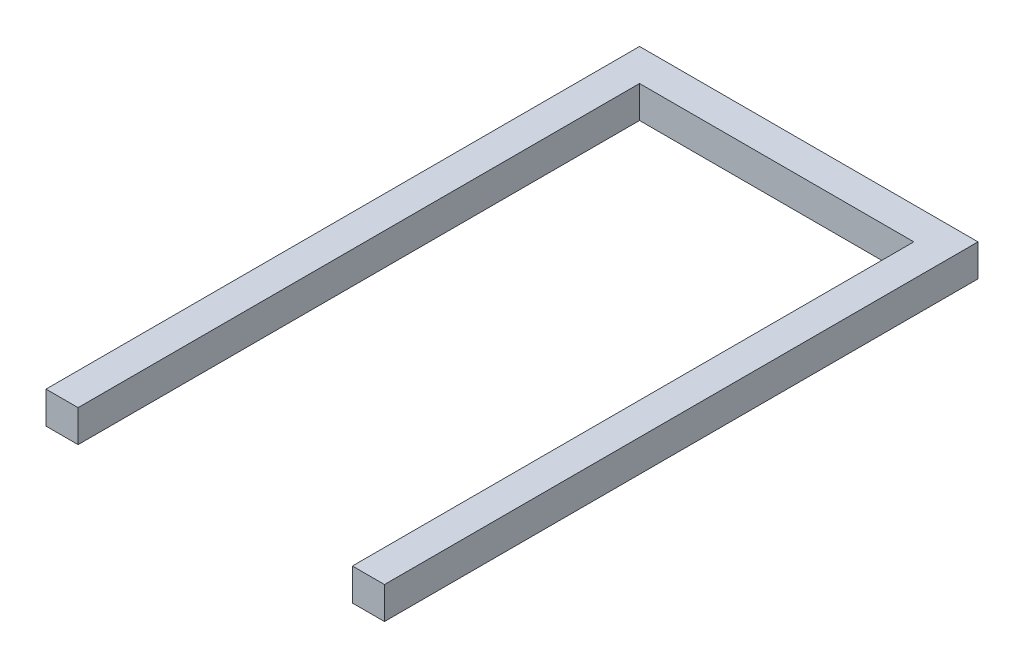
ISO-10303-21;
HEADER;
FILE_DESCRIPTION(('STEP AP214'),'2;1');
FILE_NAME('part.step','',(''),(''),'','','');
FILE_SCHEMA(('AUTOMOTIVE_DESIGN { 1 0 10303 214 1 1 1 1 }'));
ENDSEC;
DATA;
#1=APPLICATION_CONTEXT('core data for automotive mechanical design processes');
#2=APPLICATION_PROTOCOL_DEFINITION('international standard','automotive_design',2000,#1);
#3=PRODUCT_CONTEXT('',#1,'mechanical');
#4=PRODUCT('Part','Part','',(#3));
#5=PRODUCT_RELATED_PRODUCT_CATEGORY('part','',(#4));
#6=PRODUCT_DEFINITION_FORMATION('','',#4);
#7=PRODUCT_DEFINITION_CONTEXT('part definition',#1,'design');
#8=PRODUCT_DEFINITION('design','',#6,#7);
#9=PRODUCT_DEFINITION_SHAPE('','',#8);
#10=(LENGTH_UNIT() NAMED_UNIT(*) SI_UNIT(.MILLI.,.METRE.));
#11=(NAMED_UNIT(*) PLANE_ANGLE_UNIT() SI_UNIT($,.RADIAN.));
#12=(NAMED_UNIT(*) SI_UNIT($,.STERADIAN.) SOLID_ANGLE_UNIT());
#13=UNCERTAINTY_MEASURE_WITH_UNIT(LENGTH_MEASURE(1.E-05),#10,'distance_accuracy_value','');
#14=(GEOMETRIC_REPRESENTATION_CONTEXT(3) GLOBAL_UNCERTAINTY_ASSIGNED_CONTEXT((#13)) GLOBAL_UNIT_ASSIGNED_CONTEXT((#10,
#11,#12)) REPRESENTATION_CONTEXT('',''));
#15=CARTESIAN_POINT('',(0.,0.,0.));
#16=DIRECTION('',(0.,0.,1.));
#17=DIRECTION('',(1.,0.,0.));
#18=AXIS2_PLACEMENT_3D('',#15,#16,#17);
#19=CARTESIAN_POINT('',(-47.1813816435666,4.,26.7689393939394));
#20=DIRECTION('',(0.,0.,-1.));
#21=DIRECTION('',(-1.,0.,0.));
#22=AXIS2_PLACEMENT_3D('',#19,#20,#21);
#23=PLANE('',#22);
#24=DIRECTION('',(1.,0.,0.));
#25=VECTOR('',#24,1.);
#26=CARTESIAN_POINT('',(-47.1813816435666,0.,26.7689393939394));
#27=LINE('',#26,#25);
#28=CARTESIAN_POINT('',(-51.1813816435666,0.,26.7689393939394));
#29=VERTEX_POINT('',#28);
#30=CARTESIAN_POINT('',(-47.1813816435666,0.,26.7689393939394));
#31=VERTEX_POINT('',#30);
#32=EDGE_CURVE('E134',#29,#31,#27,.T.);
#33=ORIENTED_EDGE('',*,*,#32,.T.);
#34=DIRECTION('',(0.,-1.,0.));
#35=VECTOR('',#34,1.);
#36=CARTESIAN_POINT('',(-47.1813816435666,4.,26.7689393939394));
#37=LINE('',#36,#35);
#38=CARTESIAN_POINT('',(-47.1813816435666,4.,26.7689393939394));
#39=VERTEX_POINT('',#38);
#40=EDGE_CURVE('E11',#39,#31,#37,.T.);
#41=ORIENTED_EDGE('',*,*,#40,.F.);
#42=DIRECTION('',(1.,0.,0.));
#43=VECTOR('',#42,1.);
#44=CARTESIAN_POINT('',(-47.1813816435666,4.,26.7689393939394));
#45=LINE('',#44,#43);
#46=CARTESIAN_POINT('',(-51.1813816435666,4.,26.7689393939394));
#47=VERTEX_POINT('',#46);
#48=EDGE_CURVE('E146',#47,#39,#45,.T.);
#49=ORIENTED_EDGE('',*,*,#48,.F.);
#50=DIRECTION('',(0.,-1.,0.));
#51=VECTOR('',#50,1.);
#52=CARTESIAN_POINT('',(-51.1813816435666,4.,26.7689393939394));
#53=LINE('',#52,#51);
#54=EDGE_CURVE('E131',#47,#29,#53,.T.);
#55=ORIENTED_EDGE('',*,*,#54,.T.);
#56=EDGE_LOOP('',(#33,#41,#49,#55));
#57=FACE_BOUND('',#56,.T.);
#58=ADVANCED_FACE('F39',(#57),#23,.F.);
#59=CARTESIAN_POINT('',(-47.1813816435666,4.,-43.2310606060606));
#60=DIRECTION('',(-1.,0.,0.));
#61=DIRECTION('',(0.,0.,1.));
#62=AXIS2_PLACEMENT_3D('',#59,#60,#61);
#63=PLANE('',#62);
#64=DIRECTION('',(0.,0.,-1.));
#65=VECTOR('',#64,1.);
#66=CARTESIAN_POINT('',(-47.1813816435666,0.,-43.2310606060606));
#67=LINE('',#66,#65);
#68=CARTESIAN_POINT('',(-47.1813816435666,0.,-43.2310606060606));
#69=VERTEX_POINT('',#68);
#70=EDGE_CURVE('E138',#31,#69,#67,.T.);
#71=ORIENTED_EDGE('',*,*,#70,.T.);
#72=DIRECTION('',(0.,-1.,0.));
#73=VECTOR('',#72,1.);
#74=CARTESIAN_POINT('',(-47.1813816435666,4.,-43.2310606060606));
#75=LINE('',#74,#73);
#76=CARTESIAN_POINT('',(-47.1813816435666,4.,-43.2310606060606));
#77=VERTEX_POINT('',#76);
#78=EDGE_CURVE('E50',#77,#69,#75,.T.);
#79=ORIENTED_EDGE('',*,*,#78,.F.);
#80=DIRECTION('',(0.,0.,-1.));
#81=VECTOR('',#80,1.);
#82=CARTESIAN_POINT('',(-47.1813816435666,4.,-43.2310606060606));
#83=LINE('',#82,#81);
#84=EDGE_CURVE('E97',#39,#77,#83,.T.);
#85=ORIENTED_EDGE('',*,*,#84,.F.);
#86=ORIENTED_EDGE('',*,*,#40,.T.);
#87=EDGE_LOOP('',(#71,#79,#85,#86));
#88=FACE_BOUND('',#87,.T.);
#89=ADVANCED_FACE('F182',(#88),#63,.F.);
#90=CARTESIAN_POINT('',(-12.9813816435666,4.,-43.2310606060606));
#91=DIRECTION('',(0.,0.,-1.));
#92=DIRECTION('',(-1.,0.,0.));
#93=AXIS2_PLACEMENT_3D('',#90,#91,#92);
#94=PLANE('',#93);
#95=DIRECTION('',(1.,0.,0.));
#96=VECTOR('',#95,1.);
#97=CARTESIAN_POINT('',(-12.9813816435666,0.,-43.2310606060606));
#98=LINE('',#97,#96);
#99=CARTESIAN_POINT('',(-12.9813816435666,0.,-43.2310606060606));
#100=VERTEX_POINT('',#99);
#101=EDGE_CURVE('E139',#69,#100,#98,.T.);
#102=ORIENTED_EDGE('',*,*,#101,.T.);
#103=DIRECTION('',(0.,-1.,0.));
#104=VECTOR('',#103,1.);
#105=CARTESIAN_POINT('',(-12.9813816435666,4.,-43.2310606060606));
#106=LINE('',#105,#104);
#107=CARTESIAN_POINT('',(-12.9813816435666,4.,-43.2310606060606));
#108=VERTEX_POINT('',#107);
#109=EDGE_CURVE('E157',#108,#100,#106,.T.);
#110=ORIENTED_EDGE('',*,*,#109,.F.);
#111=DIRECTION('',(1.,0.,0.));
#112=VECTOR('',#111,1.);
#113=CARTESIAN_POINT('',(-12.9813816435666,4.,-43.2310606060606));
#114=LINE('',#113,#112);
#115=EDGE_CURVE('E163',#77,#108,#114,.T.);
#116=ORIENTED_EDGE('',*,*,#115,.F.);
#117=ORIENTED_EDGE('',*,*,#78,.T.);
#118=EDGE_LOOP('',(#102,#110,#116,#117));
#119=FACE_BOUND('',#118,.T.);
#120=ADVANCED_FACE('F162',(#119),#94,.F.);
#121=CARTESIAN_POINT('',(-12.9813816435666,4.,26.7689393939394));
#122=DIRECTION('',(1.,0.,0.));
#123=DIRECTION('',(0.,0.,-1.));
#124=AXIS2_PLACEMENT_3D('',#121,#122,#123);
#125=PLANE('',#124);
#126=DIRECTION('',(0.,0.,1.));
#127=VECTOR('',#126,1.);
#128=CARTESIAN_POINT('',(-12.9813816435666,0.,26.7689393939394));
#129=LINE('',#128,#127);
#130=CARTESIAN_POINT('',(-12.9813816435666,0.,26.7689393939394));
#131=VERTEX_POINT('',#130);
#132=EDGE_CURVE('E145',#100,#131,#129,.T.);
#133=ORIENTED_EDGE('',*,*,#132,.T.);
#134=DIRECTION('',(0.,-1.,0.));
#135=VECTOR('',#134,1.);
#136=CARTESIAN_POINT('',(-12.9813816435666,4.,26.7689393939394));
#137=LINE('',#136,#135);
#138=CARTESIAN_POINT('',(-12.9813816435666,4.,26.7689393939394));
#139=VERTEX_POINT('',#138);
#140=EDGE_CURVE('E154',#139,#131,#137,.T.);
#141=ORIENTED_EDGE('',*,*,#140,.F.);
#142=DIRECTION('',(0.,0.,1.));
#143=VECTOR('',#142,1.);
#144=CARTESIAN_POINT('',(-12.9813816435666,4.,26.7689393939394));
#145=LINE('',#144,#143);
#146=EDGE_CURVE('E176',#108,#139,#145,.T.);
#147=ORIENTED_EDGE('',*,*,#146,.F.);
#148=ORIENTED_EDGE('',*,*,#109,.T.);
#149=EDGE_LOOP('',(#133,#141,#147,#148));
#150=FACE_BOUND('',#149,.T.);
#151=ADVANCED_FACE('F175',(#150),#125,.F.);
#152=CARTESIAN_POINT('',(-8.98138164356655,4.,26.7689393939394));
#153=DIRECTION('',(0.,0.,-1.));
#154=DIRECTION('',(-1.,0.,0.));
#155=AXIS2_PLACEMENT_3D('',#152,#153,#154);
#156=PLANE('',#155);
#157=DIRECTION('',(1.,0.,0.));
#158=VECTOR('',#157,1.);
#159=CARTESIAN_POINT('',(-8.98138164356655,0.,26.7689393939394));
#160=LINE('',#159,#158);
#161=CARTESIAN_POINT('',(-8.98138164356655,0.,26.7689393939394));
#162=VERTEX_POINT('',#161);
#163=EDGE_CURVE('E143',#131,#162,#160,.T.);
#164=ORIENTED_EDGE('',*,*,#163,.T.);
#165=DIRECTION('',(0.,-1.,0.));
#166=VECTOR('',#165,1.);
#167=CARTESIAN_POINT('',(-8.98138164356655,4.,26.7689393939394));
#168=LINE('',#167,#166);
#169=CARTESIAN_POINT('',(-8.98138164356655,4.,26.7689393939394));
#170=VERTEX_POINT('',#169);
#171=EDGE_CURVE('E128',#170,#162,#168,.T.);
#172=ORIENTED_EDGE('',*,*,#171,.F.);
#173=DIRECTION('',(1.,0.,0.));
#174=VECTOR('',#173,1.);
#175=CARTESIAN_POINT('',(-8.98138164356655,4.,26.7689393939394));
#176=LINE('',#175,#174);
#177=EDGE_CURVE('E117',#139,#170,#176,.T.);
#178=ORIENTED_EDGE('',*,*,#177,.F.);
#179=ORIENTED_EDGE('',*,*,#140,.T.);
#180=EDGE_LOOP('',(#164,#172,#178,#179));
#181=FACE_BOUND('',#180,.T.);
#182=ADVANCED_FACE('F172',(#181),#156,.F.);
#183=CARTESIAN_POINT('',(-8.98138164356656,4.,-47.2310606060606));
#184=DIRECTION('',(-1.,0.,0.));
#185=DIRECTION('',(0.,0.,1.));
#186=AXIS2_PLACEMENT_3D('',#183,#184,#185);
#187=PLANE('',#186);
#188=DIRECTION('',(0.,0.,-1.));
#189=VECTOR('',#188,1.);
#190=CARTESIAN_POINT('',(-8.98138164356656,0.,-47.2310606060606));
#191=LINE('',#190,#189);
#192=CARTESIAN_POINT('',(-8.98138164356656,0.,-47.2310606060606));
#193=VERTEX_POINT('',#192);
#194=EDGE_CURVE('E124',#162,#193,#191,.T.);
#195=ORIENTED_EDGE('',*,*,#194,.T.);
#196=DIRECTION('',(0.,-1.,0.));
#197=VECTOR('',#196,1.);
#198=CARTESIAN_POINT('',(-8.98138164356656,4.,-47.2310606060606));
#199=LINE('',#198,#197);
#200=CARTESIAN_POINT('',(-8.98138164356656,4.,-47.2310606060606));
#201=VERTEX_POINT('',#200);
#202=EDGE_CURVE('E122',#201,#193,#199,.T.);
#203=ORIENTED_EDGE('',*,*,#202,.F.);
#204=DIRECTION('',(0.,0.,-1.));
#205=VECTOR('',#204,1.);
#206=CARTESIAN_POINT('',(-8.98138164356656,4.,-47.2310606060606));
#207=LINE('',#206,#205);
#208=EDGE_CURVE('E112',#170,#201,#207,.T.);
#209=ORIENTED_EDGE('',*,*,#208,.F.);
#210=ORIENTED_EDGE('',*,*,#171,.T.);
#211=EDGE_LOOP('',(#195,#203,#209,#210));
#212=FACE_BOUND('',#211,.T.);
#213=ADVANCED_FACE('F121',(#212),#187,.F.);
#214=CARTESIAN_POINT('',(-51.1813816435666,4.,-47.2310606060606));
#215=DIRECTION('',(0.,0.,1.));
#216=DIRECTION('',(1.,0.,0.));
#217=AXIS2_PLACEMENT_3D('',#214,#215,#216);
#218=PLANE('',#217);
#219=DIRECTION('',(-1.,0.,0.));
#220=VECTOR('',#219,1.);
#221=CARTESIAN_POINT('',(-51.1813816435666,0.,-47.2310606060606));
#222=LINE('',#221,#220);
#223=CARTESIAN_POINT('',(-51.1813816435666,0.,-47.2310606060606));
#224=VERTEX_POINT('',#223);
#225=EDGE_CURVE('E84',#193,#224,#222,.T.);
#226=ORIENTED_EDGE('',*,*,#225,.T.);
#227=DIRECTION('',(0.,-1.,0.));
#228=VECTOR('',#227,1.);
#229=CARTESIAN_POINT('',(-51.1813816435666,4.,-47.2310606060606));
#230=LINE('',#229,#228);
#231=CARTESIAN_POINT('',(-51.1813816435666,4.,-47.2310606060606));
#232=VERTEX_POINT('',#231);
#233=EDGE_CURVE('E130',#232,#224,#230,.T.);
#234=ORIENTED_EDGE('',*,*,#233,.F.);
#235=DIRECTION('',(-1.,0.,0.));
#236=VECTOR('',#235,1.);
#237=CARTESIAN_POINT('',(-51.1813816435666,4.,-47.2310606060606));
#238=LINE('',#237,#236);
#239=EDGE_CURVE('E113',#201,#232,#238,.T.);
#240=ORIENTED_EDGE('',*,*,#239,.F.);
#241=ORIENTED_EDGE('',*,*,#202,.T.);
#242=EDGE_LOOP('',(#226,#234,#240,#241));
#243=FACE_BOUND('',#242,.T.);
#244=ADVANCED_FACE('F129',(#243),#218,.F.);
#245=CARTESIAN_POINT('',(-51.1813816435666,4.,26.7689393939394));
#246=DIRECTION('',(1.,0.,0.));
#247=DIRECTION('',(0.,0.,-1.));
#248=AXIS2_PLACEMENT_3D('',#245,#246,#247);
#249=PLANE('',#248);
#250=DIRECTION('',(0.,0.,1.));
#251=VECTOR('',#250,1.);
#252=CARTESIAN_POINT('',(-51.1813816435666,0.,26.7689393939394));
#253=LINE('',#252,#251);
#254=EDGE_CURVE('E89',#224,#29,#253,.T.);
#255=ORIENTED_EDGE('',*,*,#254,.T.);
#256=ORIENTED_EDGE('',*,*,#54,.F.);
#257=DIRECTION('',(0.,0.,1.));
#258=VECTOR('',#257,1.);
#259=CARTESIAN_POINT('',(-51.1813816435666,4.,26.7689393939394));
#260=LINE('',#259,#258);
#261=EDGE_CURVE('E54',#232,#47,#260,.T.);
#262=ORIENTED_EDGE('',*,*,#261,.F.);
#263=ORIENTED_EDGE('',*,*,#233,.T.);
#264=EDGE_LOOP('',(#255,#256,#262,#263));
#265=FACE_BOUND('',#264,.T.);
#266=ADVANCED_FACE('F200',(#265),#249,.F.);
#267=CARTESIAN_POINT('',(0.,4.,0.));
#268=DIRECTION('',(0.,-1.,0.));
#269=DIRECTION('',(0.,0.,-1.));
#270=AXIS2_PLACEMENT_3D('',#267,#268,#269);
#271=PLANE('',#270);
#272=ORIENTED_EDGE('',*,*,#48,.T.);
#273=ORIENTED_EDGE('',*,*,#84,.T.);
#274=ORIENTED_EDGE('',*,*,#115,.T.);
#275=ORIENTED_EDGE('',*,*,#146,.T.);
#276=ORIENTED_EDGE('',*,*,#177,.T.);
#277=ORIENTED_EDGE('',*,*,#208,.T.);
#278=ORIENTED_EDGE('',*,*,#239,.T.);
#279=ORIENTED_EDGE('',*,*,#261,.T.);
#280=EDGE_LOOP('',(#272,#273,#274,#275,#276,#277,#278,#279));
#281=FACE_BOUND('',#280,.T.);
#282=ADVANCED_FACE('F111',(#281),#271,.F.);
#283=CARTESIAN_POINT('',(0.,0.,0.));
#284=DIRECTION('',(0.,-1.,0.));
#285=DIRECTION('',(0.,0.,-1.));
#286=AXIS2_PLACEMENT_3D('',#283,#284,#285);
#287=PLANE('',#286);
#288=ORIENTED_EDGE('',*,*,#32,.F.);
#289=ORIENTED_EDGE('',*,*,#254,.F.);
#290=ORIENTED_EDGE('',*,*,#225,.F.);
#291=ORIENTED_EDGE('',*,*,#194,.F.);
#292=ORIENTED_EDGE('',*,*,#163,.F.);
#293=ORIENTED_EDGE('',*,*,#132,.F.);
#294=ORIENTED_EDGE('',*,*,#101,.F.);
#295=ORIENTED_EDGE('',*,*,#70,.F.);
#296=EDGE_LOOP('',(#288,#289,#290,#291,#292,#293,#294,#295));
#297=FACE_BOUND('',#296,.T.);
#298=ADVANCED_FACE('F166',(#297),#287,.T.);
#299=CLOSED_SHELL('',(#58,#89,#120,#151,#182,#213,#244,#266,#282,#298));
#300=MANIFOLD_SOLID_BREP('B2',#299);
#301=ADVANCED_BREP_SHAPE_REPRESENTATION('',(#18,#300),#14);
#302=SHAPE_DEFINITION_REPRESENTATION(#9,#301);
ENDSEC;
END-ISO-10303-21;
